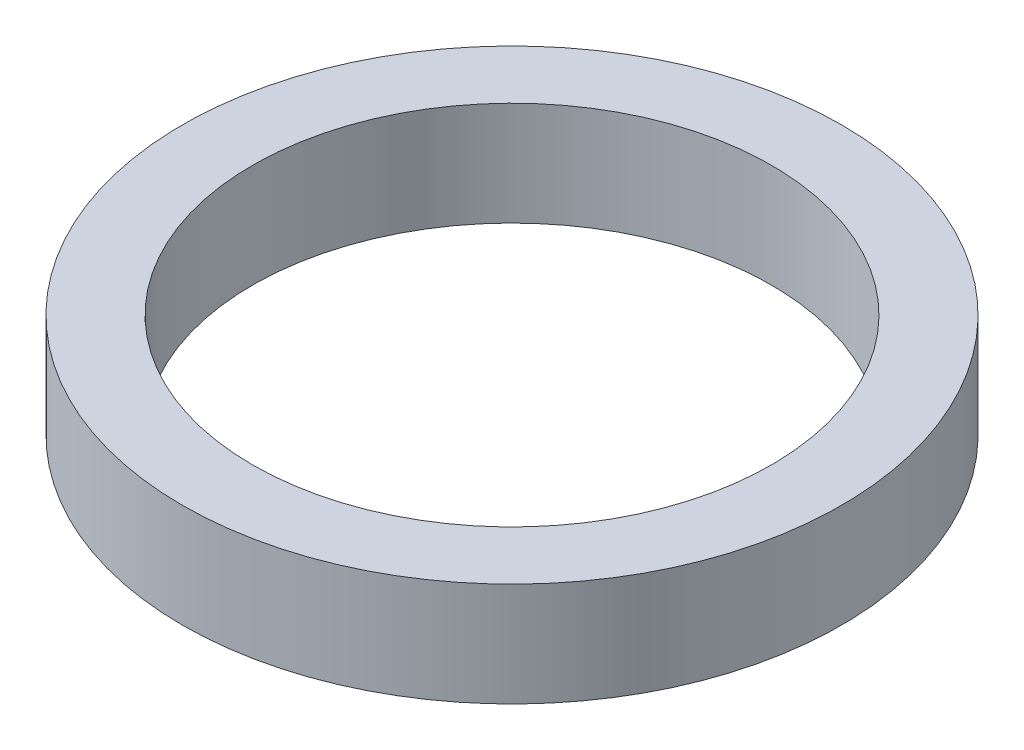
ISO-10303-21;
HEADER;
FILE_DESCRIPTION(('STEP AP214'),'2;1');
FILE_NAME('part.step','',(''),(''),'','','');
FILE_SCHEMA(('AUTOMOTIVE_DESIGN { 1 0 10303 214 1 1 1 1 }'));
ENDSEC;
DATA;
#1=APPLICATION_CONTEXT('core data for automotive mechanical design processes');
#2=APPLICATION_PROTOCOL_DEFINITION('international standard','automotive_design',2000,#1);
#3=PRODUCT_CONTEXT('',#1,'mechanical');
#4=PRODUCT('Part','Part','',(#3));
#5=PRODUCT_RELATED_PRODUCT_CATEGORY('part','',(#4));
#6=PRODUCT_DEFINITION_FORMATION('','',#4);
#7=PRODUCT_DEFINITION_CONTEXT('part definition',#1,'design');
#8=PRODUCT_DEFINITION('design','',#6,#7);
#9=PRODUCT_DEFINITION_SHAPE('','',#8);
#10=(LENGTH_UNIT() NAMED_UNIT(*) SI_UNIT(.MILLI.,.METRE.));
#11=(NAMED_UNIT(*) PLANE_ANGLE_UNIT() SI_UNIT($,.RADIAN.));
#12=(NAMED_UNIT(*) SI_UNIT($,.STERADIAN.) SOLID_ANGLE_UNIT());
#13=UNCERTAINTY_MEASURE_WITH_UNIT(LENGTH_MEASURE(1.E-05),#10,'distance_accuracy_value','');
#14=(GEOMETRIC_REPRESENTATION_CONTEXT(3) GLOBAL_UNCERTAINTY_ASSIGNED_CONTEXT((#13)) GLOBAL_UNIT_ASSIGNED_CONTEXT((#10,
#11,#12)) REPRESENTATION_CONTEXT('',''));
#15=CARTESIAN_POINT('',(0.,0.,0.));
#16=DIRECTION('',(0.,0.,1.));
#17=DIRECTION('',(1.,0.,0.));
#18=AXIS2_PLACEMENT_3D('',#15,#16,#17);
#19=CARTESIAN_POINT('',(0.,2.,0.));
#20=DIRECTION('',(0.,1.,0.));
#21=DIRECTION('',(0.,0.,1.));
#22=AXIS2_PLACEMENT_3D('',#19,#20,#21);
#23=PLANE('',#22);
#24=CARTESIAN_POINT('',(0.,2.,0.));
#25=DIRECTION('',(0.,1.,0.));
#26=DIRECTION('',(0.,0.,1.));
#27=AXIS2_PLACEMENT_3D('',#24,#25,#26);
#28=CIRCLE('',#27,6.35);
#29=CARTESIAN_POINT('',(0.,2.,6.35));
#30=VERTEX_POINT('',#29);
#31=EDGE_CURVE('E10',#30,#30,#28,.T.);
#32=ORIENTED_EDGE('',*,*,#31,.T.);
#33=EDGE_LOOP('',(#32));
#34=FACE_BOUND('',#33,.T.);
#35=CARTESIAN_POINT('',(0.,2.,0.));
#36=DIRECTION('',(0.,1.,0.));
#37=DIRECTION('',(0.,0.,1.));
#38=AXIS2_PLACEMENT_3D('',#35,#36,#37);
#39=CIRCLE('',#38,5.);
#40=CARTESIAN_POINT('',(0.,2.,5.));
#41=VERTEX_POINT('',#40);
#42=EDGE_CURVE('E58',#41,#41,#39,.T.);
#43=ORIENTED_EDGE('',*,*,#42,.F.);
#44=EDGE_LOOP('',(#43));
#45=FACE_BOUND('',#44,.T.);
#46=ADVANCED_FACE('F45',(#34,#45),#23,.T.);
#47=CARTESIAN_POINT('',(0.,0.,0.));
#48=DIRECTION('',(0.,1.,0.));
#49=DIRECTION('',(0.,0.,1.));
#50=AXIS2_PLACEMENT_3D('',#47,#48,#49);
#51=PLANE('',#50);
#52=CARTESIAN_POINT('',(0.,0.,0.));
#53=DIRECTION('',(0.,1.,0.));
#54=DIRECTION('',(0.,0.,1.));
#55=AXIS2_PLACEMENT_3D('',#52,#53,#54);
#56=CIRCLE('',#55,6.35);
#57=CARTESIAN_POINT('',(0.,0.,6.35));
#58=VERTEX_POINT('',#57);
#59=EDGE_CURVE('E49',#58,#58,#56,.T.);
#60=ORIENTED_EDGE('',*,*,#59,.F.);
#61=EDGE_LOOP('',(#60));
#62=FACE_BOUND('',#61,.T.);
#63=CARTESIAN_POINT('',(0.,0.,0.));
#64=DIRECTION('',(0.,1.,0.));
#65=DIRECTION('',(0.,0.,1.));
#66=AXIS2_PLACEMENT_3D('',#63,#64,#65);
#67=CIRCLE('',#66,5.);
#68=CARTESIAN_POINT('',(0.,0.,5.));
#69=VERTEX_POINT('',#68);
#70=EDGE_CURVE('E60',#69,#69,#67,.T.);
#71=ORIENTED_EDGE('',*,*,#70,.T.);
#72=EDGE_LOOP('',(#71));
#73=FACE_BOUND('',#72,.T.);
#74=ADVANCED_FACE('F72',(#62,#73),#51,.F.);
#75=CARTESIAN_POINT('',(0.,2.,0.));
#76=DIRECTION('',(0.,-1.,0.));
#77=DIRECTION('',(0.,0.,-1.));
#78=AXIS2_PLACEMENT_3D('',#75,#76,#77);
#79=CYLINDRICAL_SURFACE('',#78,6.35);
#80=ORIENTED_EDGE('',*,*,#31,.F.);
#81=EDGE_LOOP('',(#80));
#82=FACE_BOUND('',#81,.T.);
#83=ORIENTED_EDGE('',*,*,#59,.T.);
#84=EDGE_LOOP('',(#83));
#85=FACE_BOUND('',#84,.T.);
#86=ADVANCED_FACE('F47',(#82,#85),#79,.T.);
#87=CARTESIAN_POINT('',(0.,2.,0.));
#88=DIRECTION('',(0.,-1.,0.));
#89=DIRECTION('',(0.,0.,-1.));
#90=AXIS2_PLACEMENT_3D('',#87,#88,#89);
#91=CYLINDRICAL_SURFACE('',#90,5.);
#92=ORIENTED_EDGE('',*,*,#42,.T.);
#93=EDGE_LOOP('',(#92));
#94=FACE_BOUND('',#93,.T.);
#95=ORIENTED_EDGE('',*,*,#70,.F.);
#96=EDGE_LOOP('',(#95));
#97=FACE_BOUND('',#96,.T.);
#98=ADVANCED_FACE('F68',(#94,#97),#91,.F.);
#99=CLOSED_SHELL('',(#46,#74,#86,#98));
#100=MANIFOLD_SOLID_BREP('B2',#99);
#101=ADVANCED_BREP_SHAPE_REPRESENTATION('',(#18,#100),#14);
#102=SHAPE_DEFINITION_REPRESENTATION(#9,#101);
ENDSEC;
END-ISO-10303-21;
